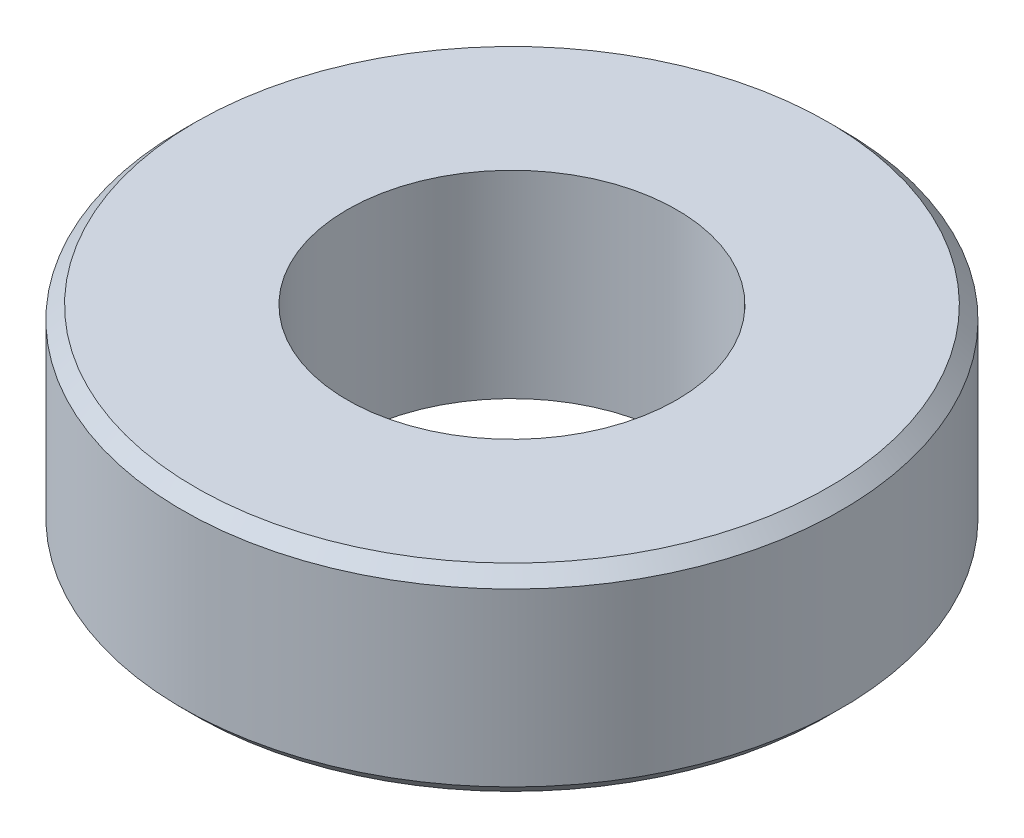
ISO-10303-21;
HEADER;
FILE_DESCRIPTION(('STEP AP214'),'2;1');
FILE_NAME('part.step','',(''),(''),'','','');
FILE_SCHEMA(('AUTOMOTIVE_DESIGN { 1 0 10303 214 1 1 1 1 }'));
ENDSEC;
DATA;
#1=APPLICATION_CONTEXT('core data for automotive mechanical design processes');
#2=APPLICATION_PROTOCOL_DEFINITION('international standard','automotive_design',2000,#1);
#3=PRODUCT_CONTEXT('',#1,'mechanical');
#4=PRODUCT('Part','Part','',(#3));
#5=PRODUCT_RELATED_PRODUCT_CATEGORY('part','',(#4));
#6=PRODUCT_DEFINITION_FORMATION('','',#4);
#7=PRODUCT_DEFINITION_CONTEXT('part definition',#1,'design');
#8=PRODUCT_DEFINITION('design','',#6,#7);
#9=PRODUCT_DEFINITION_SHAPE('','',#8);
#10=(LENGTH_UNIT() NAMED_UNIT(*) SI_UNIT(.MILLI.,.METRE.));
#11=(NAMED_UNIT(*) PLANE_ANGLE_UNIT() SI_UNIT($,.RADIAN.));
#12=(NAMED_UNIT(*) SI_UNIT($,.STERADIAN.) SOLID_ANGLE_UNIT());
#13=UNCERTAINTY_MEASURE_WITH_UNIT(LENGTH_MEASURE(1.E-05),#10,'distance_accuracy_value','');
#14=(GEOMETRIC_REPRESENTATION_CONTEXT(3) GLOBAL_UNCERTAINTY_ASSIGNED_CONTEXT((#13)) GLOBAL_UNIT_ASSIGNED_CONTEXT((#10,
#11,#12)) REPRESENTATION_CONTEXT('',''));
#15=CARTESIAN_POINT('',(0.,0.,0.));
#16=DIRECTION('',(0.,0.,1.));
#17=DIRECTION('',(1.,0.,0.));
#18=AXIS2_PLACEMENT_3D('',#15,#16,#17);
#19=CARTESIAN_POINT('',(0.,0.1,0.));
#20=DIRECTION('',(0.,1.,0.));
#21=DIRECTION('',(1.,0.,0.));
#22=AXIS2_PLACEMENT_3D('',#19,#20,#21);
#23=CONICAL_SURFACE('',#22,4.9,0.785398163397449);
#24=CARTESIAN_POINT('',(0.,0.2,0.));
#25=DIRECTION('',(0.,-1.,0.));
#26=DIRECTION('',(1.,0.,0.));
#27=AXIS2_PLACEMENT_3D('',#24,#25,#26);
#28=CIRCLE('',#27,5.);
#29=CARTESIAN_POINT('',(-5.,0.2,0.));
#30=VERTEX_POINT('',#29);
#31=EDGE_CURVE('E11',#30,#30,#28,.T.);
#32=ORIENTED_EDGE('',*,*,#31,.T.);
#33=EDGE_LOOP('',(#32));
#34=FACE_BOUND('',#33,.T.);
#35=CARTESIAN_POINT('',(0.,0.,0.));
#36=DIRECTION('',(0.,1.,0.));
#37=DIRECTION('',(1.,0.,0.));
#38=AXIS2_PLACEMENT_3D('',#35,#36,#37);
#39=CIRCLE('',#38,4.8);
#40=CARTESIAN_POINT('',(-4.8,0.,0.));
#41=VERTEX_POINT('',#40);
#42=EDGE_CURVE('E27',#41,#41,#39,.T.);
#43=ORIENTED_EDGE('',*,*,#42,.T.);
#44=EDGE_LOOP('',(#43));
#45=FACE_BOUND('',#44,.T.);
#46=ADVANCED_FACE('F16',(#34,#45),#23,.T.);
#47=CARTESIAN_POINT('',(0.,0.,0.));
#48=DIRECTION('',(0.,-1.,0.));
#49=DIRECTION('',(1.,0.,0.));
#50=AXIS2_PLACEMENT_3D('',#47,#48,#49);
#51=CYLINDRICAL_SURFACE('',#50,5.);
#52=CARTESIAN_POINT('',(0.,2.8,0.));
#53=DIRECTION('',(0.,1.,0.));
#54=DIRECTION('',(1.,0.,0.));
#55=AXIS2_PLACEMENT_3D('',#52,#53,#54);
#56=CIRCLE('',#55,5.);
#57=CARTESIAN_POINT('',(-5.,2.8,0.));
#58=VERTEX_POINT('',#57);
#59=EDGE_CURVE('E45',#58,#58,#56,.T.);
#60=ORIENTED_EDGE('',*,*,#59,.F.);
#61=EDGE_LOOP('',(#60));
#62=FACE_BOUND('',#61,.T.);
#63=ORIENTED_EDGE('',*,*,#31,.F.);
#64=EDGE_LOOP('',(#63));
#65=FACE_BOUND('',#64,.T.);
#66=ADVANCED_FACE('F46',(#62,#65),#51,.T.);
#67=CARTESIAN_POINT('',(0.,0.,0.));
#68=DIRECTION('',(0.,1.,0.));
#69=DIRECTION('',(0.,0.,1.));
#70=AXIS2_PLACEMENT_3D('',#67,#68,#69);
#71=PLANE('',#70);
#72=CARTESIAN_POINT('',(0.,0.,0.));
#73=DIRECTION('',(0.,1.,0.));
#74=DIRECTION('',(1.,0.,0.));
#75=AXIS2_PLACEMENT_3D('',#72,#73,#74);
#76=CIRCLE('',#75,2.5);
#77=CARTESIAN_POINT('',(-2.5,0.,0.));
#78=VERTEX_POINT('',#77);
#79=EDGE_CURVE('E20',#78,#78,#76,.T.);
#80=ORIENTED_EDGE('',*,*,#79,.T.);
#81=EDGE_LOOP('',(#80));
#82=FACE_BOUND('',#81,.T.);
#83=ORIENTED_EDGE('',*,*,#42,.F.);
#84=EDGE_LOOP('',(#83));
#85=FACE_BOUND('',#84,.T.);
#86=ADVANCED_FACE('F18',(#82,#85),#71,.F.);
#87=CARTESIAN_POINT('',(0.,2.9,0.));
#88=DIRECTION('',(0.,-1.,0.));
#89=DIRECTION('',(1.,0.,0.));
#90=AXIS2_PLACEMENT_3D('',#87,#88,#89);
#91=CONICAL_SURFACE('',#90,4.9,0.785398163397448);
#92=ORIENTED_EDGE('',*,*,#59,.T.);
#93=EDGE_LOOP('',(#92));
#94=FACE_BOUND('',#93,.T.);
#95=CARTESIAN_POINT('',(0.,3.,0.));
#96=DIRECTION('',(0.,-1.,0.));
#97=DIRECTION('',(1.,0.,0.));
#98=AXIS2_PLACEMENT_3D('',#95,#96,#97);
#99=CIRCLE('',#98,4.8);
#100=CARTESIAN_POINT('',(-4.8,3.,0.));
#101=VERTEX_POINT('',#100);
#102=EDGE_CURVE('E49',#101,#101,#99,.T.);
#103=ORIENTED_EDGE('',*,*,#102,.T.);
#104=EDGE_LOOP('',(#103));
#105=FACE_BOUND('',#104,.T.);
#106=ADVANCED_FACE('F67',(#94,#105),#91,.T.);
#107=CARTESIAN_POINT('',(0.,3.,0.));
#108=DIRECTION('',(0.,1.,0.));
#109=DIRECTION('',(0.,0.,1.));
#110=AXIS2_PLACEMENT_3D('',#107,#108,#109);
#111=PLANE('',#110);
#112=CARTESIAN_POINT('',(0.,3.,0.));
#113=DIRECTION('',(0.,-1.,0.));
#114=DIRECTION('',(1.,0.,0.));
#115=AXIS2_PLACEMENT_3D('',#112,#113,#114);
#116=CIRCLE('',#115,2.5);
#117=CARTESIAN_POINT('',(-2.5,3.,0.));
#118=VERTEX_POINT('',#117);
#119=EDGE_CURVE('E58',#118,#118,#116,.T.);
#120=ORIENTED_EDGE('',*,*,#119,.T.);
#121=EDGE_LOOP('',(#120));
#122=FACE_BOUND('',#121,.T.);
#123=ORIENTED_EDGE('',*,*,#102,.F.);
#124=EDGE_LOOP('',(#123));
#125=FACE_BOUND('',#124,.T.);
#126=ADVANCED_FACE('F73',(#122,#125),#111,.T.);
#127=CARTESIAN_POINT('',(0.,0.,0.));
#128=DIRECTION('',(0.,-1.,0.));
#129=DIRECTION('',(1.,0.,0.));
#130=AXIS2_PLACEMENT_3D('',#127,#128,#129);
#131=CYLINDRICAL_SURFACE('',#130,2.5);
#132=ORIENTED_EDGE('',*,*,#119,.F.);
#133=EDGE_LOOP('',(#132));
#134=FACE_BOUND('',#133,.T.);
#135=ORIENTED_EDGE('',*,*,#79,.F.);
#136=EDGE_LOOP('',(#135));
#137=FACE_BOUND('',#136,.T.);
#138=ADVANCED_FACE('F81',(#134,#137),#131,.F.);
#139=CLOSED_SHELL('',(#46,#66,#86,#106,#126,#138));
#140=MANIFOLD_SOLID_BREP('B1',#139);
#141=ADVANCED_BREP_SHAPE_REPRESENTATION('',(#18,#140),#14);
#142=SHAPE_DEFINITION_REPRESENTATION(#9,#141);
ENDSEC;
END-ISO-10303-21;
